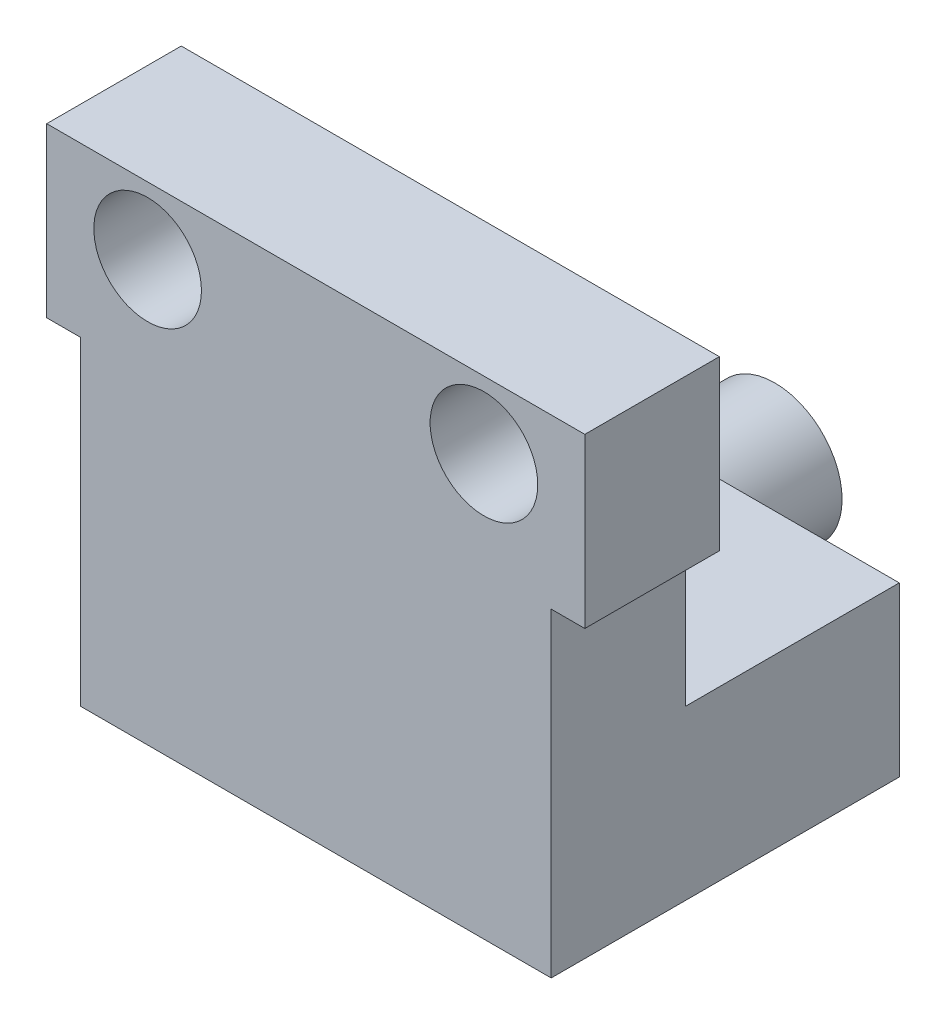
ISO-10303-21;
HEADER;
FILE_DESCRIPTION(('STEP AP214'),'2;1');
FILE_NAME('part.step','',(''),(''),'','','');
FILE_SCHEMA(('AUTOMOTIVE_DESIGN { 1 0 10303 214 1 1 1 1 }'));
ENDSEC;
DATA;
#1=APPLICATION_CONTEXT('core data for automotive mechanical design processes');
#2=APPLICATION_PROTOCOL_DEFINITION('international standard','automotive_design',2000,#1);
#3=PRODUCT_CONTEXT('',#1,'mechanical');
#4=PRODUCT('Part','Part','',(#3));
#5=PRODUCT_RELATED_PRODUCT_CATEGORY('part','',(#4));
#6=PRODUCT_DEFINITION_FORMATION('','',#4);
#7=PRODUCT_DEFINITION_CONTEXT('part definition',#1,'design');
#8=PRODUCT_DEFINITION('design','',#6,#7);
#9=PRODUCT_DEFINITION_SHAPE('','',#8);
#10=(LENGTH_UNIT() NAMED_UNIT(*) SI_UNIT(.MILLI.,.METRE.));
#11=(NAMED_UNIT(*) PLANE_ANGLE_UNIT() SI_UNIT($,.RADIAN.));
#12=(NAMED_UNIT(*) SI_UNIT($,.STERADIAN.) SOLID_ANGLE_UNIT());
#13=UNCERTAINTY_MEASURE_WITH_UNIT(LENGTH_MEASURE(1.E-05),#10,'distance_accuracy_value','');
#14=(GEOMETRIC_REPRESENTATION_CONTEXT(3) GLOBAL_UNCERTAINTY_ASSIGNED_CONTEXT((#13)) GLOBAL_UNIT_ASSIGNED_CONTEXT((#10,
#11,#12)) REPRESENTATION_CONTEXT('',''));
#15=CARTESIAN_POINT('',(0.,0.,0.));
#16=DIRECTION('',(0.,0.,1.));
#17=DIRECTION('',(1.,0.,0.));
#18=AXIS2_PLACEMENT_3D('',#15,#16,#17);
#19=CARTESIAN_POINT('',(0.,0.,53.));
#20=DIRECTION('',(0.,0.,1.));
#21=DIRECTION('',(1.,0.,0.));
#22=AXIS2_PLACEMENT_3D('',#19,#20,#21);
#23=PLANE('',#22);
#24=CARTESIAN_POINT('',(-5.,27.,53.));
#25=DIRECTION('',(0.,0.,1.));
#26=DIRECTION('',(1.,0.,0.));
#27=AXIS2_PLACEMENT_3D('',#24,#25,#26);
#28=CIRCLE('',#27,1.6);
#29=CARTESIAN_POINT('',(-3.4,27.,53.));
#30=VERTEX_POINT('',#29);
#31=EDGE_CURVE('E209',#30,#30,#28,.F.);
#32=ORIENTED_EDGE('',*,*,#31,.F.);
#33=EDGE_LOOP('',(#32));
#34=FACE_BOUND('',#33,.T.);
#35=CARTESIAN_POINT('',(5.,27.,53.));
#36=DIRECTION('',(0.,0.,1.));
#37=DIRECTION('',(1.,0.,0.));
#38=AXIS2_PLACEMENT_3D('',#35,#36,#37);
#39=CIRCLE('',#38,1.6);
#40=CARTESIAN_POINT('',(6.6,27.,53.));
#41=VERTEX_POINT('',#40);
#42=EDGE_CURVE('E203',#41,#41,#39,.F.);
#43=ORIENTED_EDGE('',*,*,#42,.F.);
#44=EDGE_LOOP('',(#43));
#45=FACE_BOUND('',#44,.T.);
#46=DIRECTION('',(1.,0.,0.));
#47=VECTOR('',#46,1.);
#48=CARTESIAN_POINT('',(0.,19.5,53.));
#49=LINE('',#48,#47);
#50=CARTESIAN_POINT('',(-7.,19.5,53.));
#51=VERTEX_POINT('',#50);
#52=CARTESIAN_POINT('',(7.,19.5,53.));
#53=VERTEX_POINT('',#52);
#54=EDGE_CURVE('E49',#51,#53,#49,.T.);
#55=ORIENTED_EDGE('',*,*,#54,.F.);
#56=DIRECTION('',(0.,-1.,0.));
#57=VECTOR('',#56,1.);
#58=CARTESIAN_POINT('',(-7.,24.2,53.));
#59=LINE('',#58,#57);
#60=CARTESIAN_POINT('',(-7.,24.,53.));
#61=VERTEX_POINT('',#60);
#62=EDGE_CURVE('E149',#61,#51,#59,.T.);
#63=ORIENTED_EDGE('',*,*,#62,.F.);
#64=DIRECTION('',(1.,0.,0.));
#65=VECTOR('',#64,1.);
#66=CARTESIAN_POINT('',(-8.,24.,53.));
#67=LINE('',#66,#65);
#68=CARTESIAN_POINT('',(-8.,24.,53.));
#69=VERTEX_POINT('',#68);
#70=EDGE_CURVE('E177',#69,#61,#67,.T.);
#71=ORIENTED_EDGE('',*,*,#70,.F.);
#72=DIRECTION('',(0.,-1.,0.));
#73=VECTOR('',#72,1.);
#74=CARTESIAN_POINT('',(-8.,29.,53.));
#75=LINE('',#74,#73);
#76=CARTESIAN_POINT('',(-8.,29.,53.));
#77=VERTEX_POINT('',#76);
#78=EDGE_CURVE('E161',#77,#69,#75,.T.);
#79=ORIENTED_EDGE('',*,*,#78,.F.);
#80=DIRECTION('',(-1.,0.,0.));
#81=VECTOR('',#80,1.);
#82=CARTESIAN_POINT('',(8.,29.,53.));
#83=LINE('',#82,#81);
#84=CARTESIAN_POINT('',(8.,29.,53.));
#85=VERTEX_POINT('',#84);
#86=EDGE_CURVE('E166',#85,#77,#83,.T.);
#87=ORIENTED_EDGE('',*,*,#86,.F.);
#88=DIRECTION('',(0.,1.,0.));
#89=VECTOR('',#88,1.);
#90=CARTESIAN_POINT('',(8.,24.,53.));
#91=LINE('',#90,#89);
#92=CARTESIAN_POINT('',(8.,24.,53.));
#93=VERTEX_POINT('',#92);
#94=EDGE_CURVE('E181',#93,#85,#91,.T.);
#95=ORIENTED_EDGE('',*,*,#94,.F.);
#96=CARTESIAN_POINT('',(7.,24.,53.));
#97=VERTEX_POINT('',#96);
#98=EDGE_CURVE('E178',#97,#93,#67,.T.);
#99=ORIENTED_EDGE('',*,*,#98,.F.);
#100=DIRECTION('',(0.,1.,0.));
#101=VECTOR('',#100,1.);
#102=CARTESIAN_POINT('',(7.,14.5,53.));
#103=LINE('',#102,#101);
#104=EDGE_CURVE('E155',#53,#97,#103,.T.);
#105=ORIENTED_EDGE('',*,*,#104,.F.);
#106=EDGE_LOOP('',(#55,#63,#71,#79,#87,#95,#99,#105));
#107=FACE_BOUND('',#106,.T.);
#108=ADVANCED_FACE('F41',(#34,#45,#107),#23,.F.);
#109=CARTESIAN_POINT('',(-8.,24.,57.));
#110=DIRECTION('',(0.,1.,0.));
#111=DIRECTION('',(0.,0.,1.));
#112=AXIS2_PLACEMENT_3D('',#109,#110,#111);
#113=PLANE('',#112);
#114=DIRECTION('',(0.,0.,-1.));
#115=VECTOR('',#114,1.);
#116=CARTESIAN_POINT('',(-7.,24.,57.));
#117=LINE('',#116,#115);
#118=CARTESIAN_POINT('',(-7.,24.,57.));
#119=VERTEX_POINT('',#118);
#120=EDGE_CURVE('E63',#119,#61,#117,.T.);
#121=ORIENTED_EDGE('',*,*,#120,.F.);
#122=DIRECTION('',(1.,0.,0.));
#123=VECTOR('',#122,1.);
#124=CARTESIAN_POINT('',(-8.,24.,57.));
#125=LINE('',#124,#123);
#126=CARTESIAN_POINT('',(-8.,24.,57.));
#127=VERTEX_POINT('',#126);
#128=EDGE_CURVE('E169',#127,#119,#125,.T.);
#129=ORIENTED_EDGE('',*,*,#128,.F.);
#130=DIRECTION('',(0.,0.,-1.));
#131=VECTOR('',#130,1.);
#132=CARTESIAN_POINT('',(-8.,24.,57.));
#133=LINE('',#132,#131);
#134=EDGE_CURVE('E195',#127,#69,#133,.T.);
#135=ORIENTED_EDGE('',*,*,#134,.T.);
#136=ORIENTED_EDGE('',*,*,#70,.T.);
#137=EDGE_LOOP('',(#121,#129,#135,#136));
#138=FACE_BOUND('',#137,.T.);
#139=ADVANCED_FACE('F232',(#138),#113,.F.);
#140=DIRECTION('',(0.,0.,1.));
#141=VECTOR('',#140,1.);
#142=CARTESIAN_POINT('',(7.,24.,57.));
#143=LINE('',#142,#141);
#144=CARTESIAN_POINT('',(7.,24.,57.));
#145=VERTEX_POINT('',#144);
#146=EDGE_CURVE('E193',#97,#145,#143,.T.);
#147=ORIENTED_EDGE('',*,*,#146,.F.);
#148=ORIENTED_EDGE('',*,*,#98,.T.);
#149=DIRECTION('',(0.,0.,-1.));
#150=VECTOR('',#149,1.);
#151=CARTESIAN_POINT('',(8.,24.,57.));
#152=LINE('',#151,#150);
#153=CARTESIAN_POINT('',(8.,24.,57.));
#154=VERTEX_POINT('',#153);
#155=EDGE_CURVE('E186',#154,#93,#152,.T.);
#156=ORIENTED_EDGE('',*,*,#155,.F.);
#157=EDGE_CURVE('E170',#145,#154,#125,.T.);
#158=ORIENTED_EDGE('',*,*,#157,.F.);
#159=EDGE_LOOP('',(#147,#148,#156,#158));
#160=FACE_BOUND('',#159,.T.);
#161=ADVANCED_FACE('F248',(#160),#113,.F.);
#162=CARTESIAN_POINT('',(-8.,29.,57.));
#163=DIRECTION('',(1.,0.,0.));
#164=DIRECTION('',(0.,0.,-1.));
#165=AXIS2_PLACEMENT_3D('',#162,#163,#164);
#166=PLANE('',#165);
#167=ORIENTED_EDGE('',*,*,#78,.T.);
#168=ORIENTED_EDGE('',*,*,#134,.F.);
#169=DIRECTION('',(0.,-1.,0.));
#170=VECTOR('',#169,1.);
#171=CARTESIAN_POINT('',(-8.,29.,57.));
#172=LINE('',#171,#170);
#173=CARTESIAN_POINT('',(-8.,29.,57.));
#174=VERTEX_POINT('',#173);
#175=EDGE_CURVE('E165',#174,#127,#172,.T.);
#176=ORIENTED_EDGE('',*,*,#175,.F.);
#177=DIRECTION('',(0.,0.,-1.));
#178=VECTOR('',#177,1.);
#179=CARTESIAN_POINT('',(-8.,29.,57.));
#180=LINE('',#179,#178);
#181=EDGE_CURVE('E174',#174,#77,#180,.T.);
#182=ORIENTED_EDGE('',*,*,#181,.T.);
#183=EDGE_LOOP('',(#167,#168,#176,#182));
#184=FACE_BOUND('',#183,.T.);
#185=ADVANCED_FACE('F43',(#184),#166,.F.);
#186=CARTESIAN_POINT('',(8.,24.,57.));
#187=DIRECTION('',(-1.,0.,0.));
#188=DIRECTION('',(0.,0.,1.));
#189=AXIS2_PLACEMENT_3D('',#186,#187,#188);
#190=PLANE('',#189);
#191=ORIENTED_EDGE('',*,*,#94,.T.);
#192=DIRECTION('',(0.,0.,-1.));
#193=VECTOR('',#192,1.);
#194=CARTESIAN_POINT('',(8.,29.,57.));
#195=LINE('',#194,#193);
#196=CARTESIAN_POINT('',(8.,29.,57.));
#197=VERTEX_POINT('',#196);
#198=EDGE_CURVE('E187',#197,#85,#195,.T.);
#199=ORIENTED_EDGE('',*,*,#198,.F.);
#200=DIRECTION('',(0.,1.,0.));
#201=VECTOR('',#200,1.);
#202=CARTESIAN_POINT('',(8.,24.,57.));
#203=LINE('',#202,#201);
#204=EDGE_CURVE('E171',#154,#197,#203,.T.);
#205=ORIENTED_EDGE('',*,*,#204,.F.);
#206=ORIENTED_EDGE('',*,*,#155,.T.);
#207=EDGE_LOOP('',(#191,#199,#205,#206));
#208=FACE_BOUND('',#207,.T.);
#209=ADVANCED_FACE('F246',(#208),#190,.F.);
#210=CARTESIAN_POINT('',(8.,29.,57.));
#211=DIRECTION('',(0.,-1.,0.));
#212=DIRECTION('',(0.,0.,-1.));
#213=AXIS2_PLACEMENT_3D('',#210,#211,#212);
#214=PLANE('',#213);
#215=ORIENTED_EDGE('',*,*,#86,.T.);
#216=ORIENTED_EDGE('',*,*,#181,.F.);
#217=DIRECTION('',(-1.,0.,0.));
#218=VECTOR('',#217,1.);
#219=CARTESIAN_POINT('',(8.,29.,57.));
#220=LINE('',#219,#218);
#221=EDGE_CURVE('E173',#197,#174,#220,.T.);
#222=ORIENTED_EDGE('',*,*,#221,.F.);
#223=ORIENTED_EDGE('',*,*,#198,.T.);
#224=EDGE_LOOP('',(#215,#216,#222,#223));
#225=FACE_BOUND('',#224,.T.);
#226=ADVANCED_FACE('F241',(#225),#214,.F.);
#227=CARTESIAN_POINT('',(0.,0.,57.));
#228=DIRECTION('',(0.,0.,1.));
#229=DIRECTION('',(1.,0.,0.));
#230=AXIS2_PLACEMENT_3D('',#227,#228,#229);
#231=PLANE('',#230);
#232=CARTESIAN_POINT('',(-5.,27.,57.));
#233=DIRECTION('',(0.,0.,1.));
#234=DIRECTION('',(1.,0.,0.));
#235=AXIS2_PLACEMENT_3D('',#232,#233,#234);
#236=CIRCLE('',#235,1.6);
#237=CARTESIAN_POINT('',(-3.4,27.,57.));
#238=VERTEX_POINT('',#237);
#239=EDGE_CURVE('E44',#238,#238,#236,.F.);
#240=ORIENTED_EDGE('',*,*,#239,.T.);
#241=EDGE_LOOP('',(#240));
#242=FACE_BOUND('',#241,.T.);
#243=CARTESIAN_POINT('',(5.,27.,57.));
#244=DIRECTION('',(0.,0.,1.));
#245=DIRECTION('',(1.,0.,0.));
#246=AXIS2_PLACEMENT_3D('',#243,#244,#245);
#247=CIRCLE('',#246,1.6);
#248=CARTESIAN_POINT('',(6.6,27.,57.));
#249=VERTEX_POINT('',#248);
#250=EDGE_CURVE('E199',#249,#249,#247,.F.);
#251=ORIENTED_EDGE('',*,*,#250,.T.);
#252=EDGE_LOOP('',(#251));
#253=FACE_BOUND('',#252,.T.);
#254=ORIENTED_EDGE('',*,*,#128,.T.);
#255=DIRECTION('',(0.,-1.,0.));
#256=VECTOR('',#255,1.);
#257=CARTESIAN_POINT('',(-7.,24.2,57.));
#258=LINE('',#257,#256);
#259=CARTESIAN_POINT('',(-7.,14.5,57.));
#260=VERTEX_POINT('',#259);
#261=EDGE_CURVE('E146',#119,#260,#258,.T.);
#262=ORIENTED_EDGE('',*,*,#261,.T.);
#263=DIRECTION('',(1.,0.,0.));
#264=VECTOR('',#263,1.);
#265=CARTESIAN_POINT('',(-7.,14.5,57.));
#266=LINE('',#265,#264);
#267=CARTESIAN_POINT('',(7.,14.5,57.));
#268=VERTEX_POINT('',#267);
#269=EDGE_CURVE('E153',#260,#268,#266,.T.);
#270=ORIENTED_EDGE('',*,*,#269,.T.);
#271=DIRECTION('',(0.,1.,0.));
#272=VECTOR('',#271,1.);
#273=CARTESIAN_POINT('',(7.,14.5,57.));
#274=LINE('',#273,#272);
#275=EDGE_CURVE('E154',#268,#145,#274,.T.);
#276=ORIENTED_EDGE('',*,*,#275,.T.);
#277=ORIENTED_EDGE('',*,*,#157,.T.);
#278=ORIENTED_EDGE('',*,*,#204,.T.);
#279=ORIENTED_EDGE('',*,*,#221,.T.);
#280=ORIENTED_EDGE('',*,*,#175,.T.);
#281=EDGE_LOOP('',(#254,#262,#270,#276,#277,#278,#279,#280));
#282=FACE_BOUND('',#281,.T.);
#283=ADVANCED_FACE('F227',(#242,#253,#282),#231,.T.);
#284=CARTESIAN_POINT('',(-7.,24.2,57.));
#285=DIRECTION('',(1.,0.,0.));
#286=DIRECTION('',(0.,0.,-1.));
#287=AXIS2_PLACEMENT_3D('',#284,#285,#286);
#288=PLANE('',#287);
#289=DIRECTION('',(0.,-1.,0.));
#290=VECTOR('',#289,1.);
#291=CARTESIAN_POINT('',(-7.,19.5,46.65));
#292=LINE('',#291,#290);
#293=CARTESIAN_POINT('',(-7.,19.5,46.65));
#294=VERTEX_POINT('',#293);
#295=CARTESIAN_POINT('',(-7.,14.5,46.65));
#296=VERTEX_POINT('',#295);
#297=EDGE_CURVE('E136',#294,#296,#292,.T.);
#298=ORIENTED_EDGE('',*,*,#297,.T.);
#299=DIRECTION('',(0.,0.,-1.));
#300=VECTOR('',#299,1.);
#301=CARTESIAN_POINT('',(-7.,14.5,57.));
#302=LINE('',#301,#300);
#303=EDGE_CURVE('E163',#260,#296,#302,.T.);
#304=ORIENTED_EDGE('',*,*,#303,.F.);
#305=ORIENTED_EDGE('',*,*,#261,.F.);
#306=ORIENTED_EDGE('',*,*,#120,.T.);
#307=ORIENTED_EDGE('',*,*,#62,.T.);
#308=DIRECTION('',(0.,0.,-1.));
#309=VECTOR('',#308,1.);
#310=CARTESIAN_POINT('',(-7.,19.5,53.2));
#311=LINE('',#310,#309);
#312=EDGE_CURVE('E134',#51,#294,#311,.T.);
#313=ORIENTED_EDGE('',*,*,#312,.T.);
#314=EDGE_LOOP('',(#298,#304,#305,#306,#307,#313));
#315=FACE_BOUND('',#314,.T.);
#316=ADVANCED_FACE('F233',(#315),#288,.F.);
#317=CARTESIAN_POINT('',(7.,14.5,57.));
#318=DIRECTION('',(-1.,0.,0.));
#319=DIRECTION('',(0.,0.,1.));
#320=AXIS2_PLACEMENT_3D('',#317,#318,#319);
#321=PLANE('',#320);
#322=DIRECTION('',(0.,0.,-1.));
#323=VECTOR('',#322,1.);
#324=CARTESIAN_POINT('',(7.,19.5,53.2));
#325=LINE('',#324,#323);
#326=CARTESIAN_POINT('',(7.,19.5,46.65));
#327=VERTEX_POINT('',#326);
#328=EDGE_CURVE('E126',#53,#327,#325,.T.);
#329=ORIENTED_EDGE('',*,*,#328,.F.);
#330=ORIENTED_EDGE('',*,*,#104,.T.);
#331=ORIENTED_EDGE('',*,*,#146,.T.);
#332=ORIENTED_EDGE('',*,*,#275,.F.);
#333=DIRECTION('',(0.,0.,-1.));
#334=VECTOR('',#333,1.);
#335=CARTESIAN_POINT('',(7.,14.5,57.));
#336=LINE('',#335,#334);
#337=CARTESIAN_POINT('',(7.,14.5,46.65));
#338=VERTEX_POINT('',#337);
#339=EDGE_CURVE('E159',#268,#338,#336,.T.);
#340=ORIENTED_EDGE('',*,*,#339,.T.);
#341=DIRECTION('',(0.,1.,0.));
#342=VECTOR('',#341,1.);
#343=CARTESIAN_POINT('',(7.,14.5,46.65));
#344=LINE('',#343,#342);
#345=EDGE_CURVE('E142',#338,#327,#344,.T.);
#346=ORIENTED_EDGE('',*,*,#345,.T.);
#347=EDGE_LOOP('',(#329,#330,#331,#332,#340,#346));
#348=FACE_BOUND('',#347,.T.);
#349=ADVANCED_FACE('F225',(#348),#321,.F.);
#350=CARTESIAN_POINT('',(-7.,14.5,57.));
#351=DIRECTION('',(0.,1.,0.));
#352=DIRECTION('',(0.,0.,1.));
#353=AXIS2_PLACEMENT_3D('',#350,#351,#352);
#354=PLANE('',#353);
#355=ORIENTED_EDGE('',*,*,#303,.T.);
#356=DIRECTION('',(1.,0.,0.));
#357=VECTOR('',#356,1.);
#358=CARTESIAN_POINT('',(-7.,14.5,46.65));
#359=LINE('',#358,#357);
#360=EDGE_CURVE('E145',#296,#338,#359,.T.);
#361=ORIENTED_EDGE('',*,*,#360,.T.);
#362=ORIENTED_EDGE('',*,*,#339,.F.);
#363=ORIENTED_EDGE('',*,*,#269,.F.);
#364=EDGE_LOOP('',(#355,#361,#362,#363));
#365=FACE_BOUND('',#364,.T.);
#366=ADVANCED_FACE('F219',(#365),#354,.F.);
#367=CARTESIAN_POINT('',(7.,19.5,53.2));
#368=DIRECTION('',(0.,-1.,0.));
#369=DIRECTION('',(0.,0.,-1.));
#370=AXIS2_PLACEMENT_3D('',#367,#368,#369);
#371=PLANE('',#370);
#372=ORIENTED_EDGE('',*,*,#312,.F.);
#373=ORIENTED_EDGE('',*,*,#54,.T.);
#374=ORIENTED_EDGE('',*,*,#328,.T.);
#375=DIRECTION('',(-1.,0.,0.));
#376=VECTOR('',#375,1.);
#377=CARTESIAN_POINT('',(7.,19.5,46.65));
#378=LINE('',#377,#376);
#379=CARTESIAN_POINT('',(0.,19.5,46.65));
#380=VERTEX_POINT('',#379);
#381=EDGE_CURVE('E125',#327,#380,#378,.T.);
#382=ORIENTED_EDGE('',*,*,#381,.T.);
#383=EDGE_CURVE('E127',#380,#294,#378,.T.);
#384=ORIENTED_EDGE('',*,*,#383,.T.);
#385=EDGE_LOOP('',(#372,#373,#374,#382,#384));
#386=FACE_BOUND('',#385,.T.);
#387=ADVANCED_FACE('F123',(#386),#371,.F.);
#388=CARTESIAN_POINT('',(0.,0.,46.65));
#389=DIRECTION('',(0.,0.,1.));
#390=DIRECTION('',(1.,0.,0.));
#391=AXIS2_PLACEMENT_3D('',#388,#389,#390);
#392=PLANE('',#391);
#393=ORIENTED_EDGE('',*,*,#383,.F.);
#394=CARTESIAN_POINT('',(0.,17.5,46.65));
#395=DIRECTION('',(0.,0.,1.));
#396=DIRECTION('',(1.,0.,0.));
#397=AXIS2_PLACEMENT_3D('',#394,#395,#396);
#398=CIRCLE('',#397,2.);
#399=EDGE_CURVE('E11',#380,#380,#398,.F.);
#400=ORIENTED_EDGE('',*,*,#399,.F.);
#401=ORIENTED_EDGE('',*,*,#381,.F.);
#402=ORIENTED_EDGE('',*,*,#345,.F.);
#403=ORIENTED_EDGE('',*,*,#360,.F.);
#404=ORIENTED_EDGE('',*,*,#297,.F.);
#405=EDGE_LOOP('',(#393,#400,#401,#402,#403,#404));
#406=FACE_BOUND('',#405,.T.);
#407=ADVANCED_FACE('F139',(#406),#392,.F.);
#408=CARTESIAN_POINT('',(0.,17.5,46.85));
#409=DIRECTION('',(0.,0.,-1.));
#410=DIRECTION('',(-1.,0.,0.));
#411=AXIS2_PLACEMENT_3D('',#408,#409,#410);
#412=CYLINDRICAL_SURFACE('',#411,2.);
#413=CARTESIAN_POINT('',(0.,17.5,43.35));
#414=DIRECTION('',(0.,0.,1.));
#415=DIRECTION('',(1.,0.,0.));
#416=AXIS2_PLACEMENT_3D('',#413,#414,#415);
#417=CIRCLE('',#416,2.);
#418=CARTESIAN_POINT('',(2.,17.5,43.35));
#419=VERTEX_POINT('',#418);
#420=EDGE_CURVE('E214',#419,#419,#417,.T.);
#421=ORIENTED_EDGE('',*,*,#420,.T.);
#422=EDGE_LOOP('',(#421));
#423=FACE_BOUND('',#422,.T.);
#424=ORIENTED_EDGE('',*,*,#399,.T.);
#425=EDGE_LOOP('',(#424));
#426=FACE_BOUND('',#425,.T.);
#427=ADVANCED_FACE('F332',(#423,#426),#412,.T.);
#428=CARTESIAN_POINT('',(0.,17.5,43.35));
#429=DIRECTION('',(0.,0.,1.));
#430=DIRECTION('',(1.,0.,0.));
#431=AXIS2_PLACEMENT_3D('',#428,#429,#430);
#432=PLANE('',#431);
#433=ORIENTED_EDGE('',*,*,#420,.F.);
#434=EDGE_LOOP('',(#433));
#435=FACE_BOUND('',#434,.T.);
#436=ADVANCED_FACE('F342',(#435),#432,.F.);
#437=CARTESIAN_POINT('',(5.,27.,57.1));
#438=DIRECTION('',(0.,0.,-1.));
#439=DIRECTION('',(-1.,0.,0.));
#440=AXIS2_PLACEMENT_3D('',#437,#438,#439);
#441=CYLINDRICAL_SURFACE('',#440,1.6);
#442=ORIENTED_EDGE('',*,*,#250,.F.);
#443=EDGE_LOOP('',(#442));
#444=FACE_BOUND('',#443,.T.);
#445=ORIENTED_EDGE('',*,*,#42,.T.);
#446=EDGE_LOOP('',(#445));
#447=FACE_BOUND('',#446,.T.);
#448=ADVANCED_FACE('F349',(#444,#447),#441,.F.);
#449=CARTESIAN_POINT('',(-5.,27.,57.1));
#450=DIRECTION('',(0.,0.,-1.));
#451=DIRECTION('',(-1.,0.,0.));
#452=AXIS2_PLACEMENT_3D('',#449,#450,#451);
#453=CYLINDRICAL_SURFACE('',#452,1.6);
#454=ORIENTED_EDGE('',*,*,#239,.F.);
#455=EDGE_LOOP('',(#454));
#456=FACE_BOUND('',#455,.T.);
#457=ORIENTED_EDGE('',*,*,#31,.T.);
#458=EDGE_LOOP('',(#457));
#459=FACE_BOUND('',#458,.T.);
#460=ADVANCED_FACE('F356',(#456,#459),#453,.F.);
#461=CLOSED_SHELL('',(#108,#139,#161,#185,#209,#226,#283,#316,#349,#366,#387,#407,#427,#436,
#448,#460));
#462=MANIFOLD_SOLID_BREP('B2',#461);
#463=ADVANCED_BREP_SHAPE_REPRESENTATION('',(#18,#462),#14);
#464=SHAPE_DEFINITION_REPRESENTATION(#9,#463);
ENDSEC;
END-ISO-10303-21;
